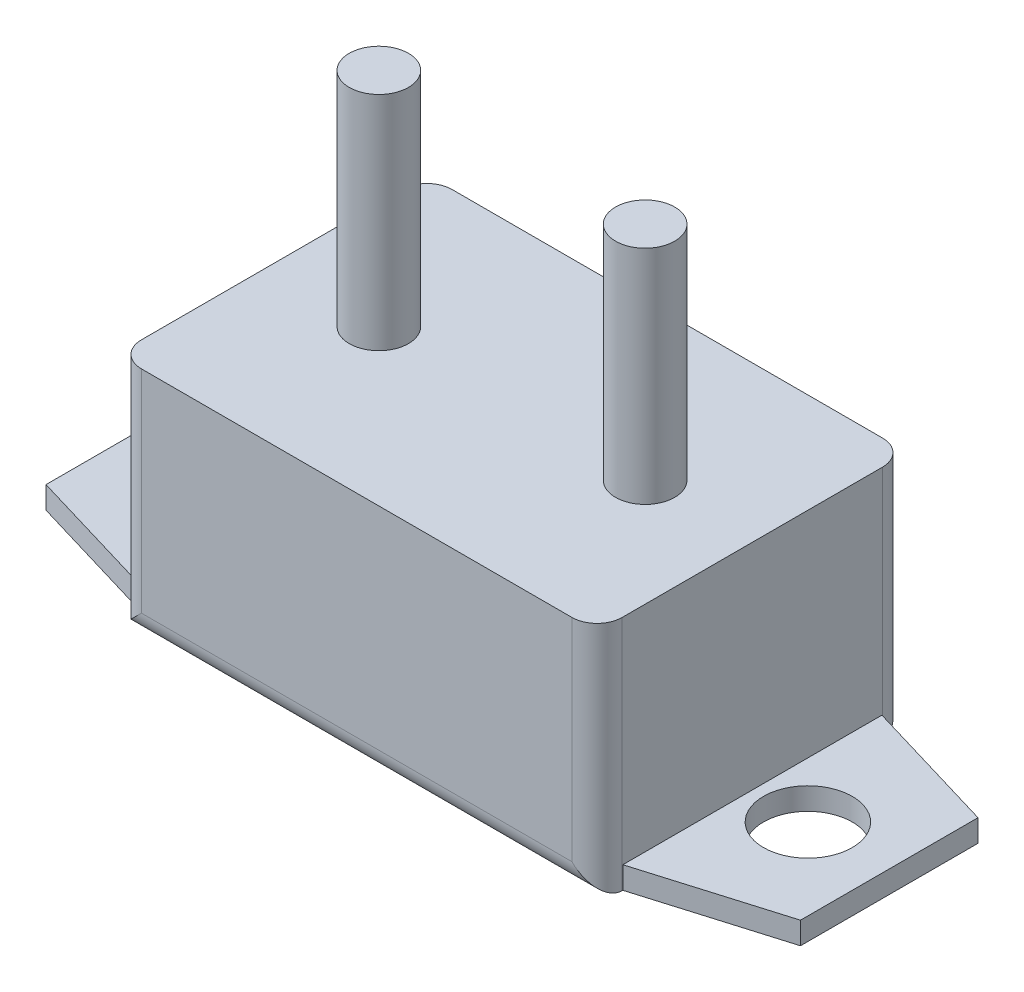
ISO-10303-21;
HEADER;
FILE_DESCRIPTION(('STEP AP214'),'2;1');
FILE_NAME('part.step','',(''),(''),'','','');
FILE_SCHEMA(('AUTOMOTIVE_DESIGN { 1 0 10303 214 1 1 1 1 }'));
ENDSEC;
DATA;
#1=APPLICATION_CONTEXT('core data for automotive mechanical design processes');
#2=APPLICATION_PROTOCOL_DEFINITION('international standard','automotive_design',2000,#1);
#3=PRODUCT_CONTEXT('',#1,'mechanical');
#4=PRODUCT('Part','Part','',(#3));
#5=PRODUCT_RELATED_PRODUCT_CATEGORY('part','',(#4));
#6=PRODUCT_DEFINITION_FORMATION('','',#4);
#7=PRODUCT_DEFINITION_CONTEXT('part definition',#1,'design');
#8=PRODUCT_DEFINITION('design','',#6,#7);
#9=PRODUCT_DEFINITION_SHAPE('','',#8);
#10=(LENGTH_UNIT() NAMED_UNIT(*) SI_UNIT(.MILLI.,.METRE.));
#11=(NAMED_UNIT(*) PLANE_ANGLE_UNIT() SI_UNIT($,.RADIAN.));
#12=(NAMED_UNIT(*) SI_UNIT($,.STERADIAN.) SOLID_ANGLE_UNIT());
#13=UNCERTAINTY_MEASURE_WITH_UNIT(LENGTH_MEASURE(1.E-05),#10,'distance_accuracy_value','');
#14=(GEOMETRIC_REPRESENTATION_CONTEXT(3) GLOBAL_UNCERTAINTY_ASSIGNED_CONTEXT((#13)) GLOBAL_UNIT_ASSIGNED_CONTEXT((#10,
#11,#12)) REPRESENTATION_CONTEXT('',''));
#15=CARTESIAN_POINT('',(0.,0.,0.));
#16=DIRECTION('',(0.,0.,1.));
#17=DIRECTION('',(1.,0.,0.));
#18=AXIS2_PLACEMENT_3D('',#15,#16,#17);
#19=CARTESIAN_POINT('',(16.25,16.,-10.5));
#20=DIRECTION('',(-1.,0.,0.));
#21=DIRECTION('',(0.,0.,1.));
#22=AXIS2_PLACEMENT_3D('',#19,#20,#21);
#23=PLANE('',#22);
#24=DIRECTION('',(0.,0.,-1.));
#25=VECTOR('',#24,1.);
#26=CARTESIAN_POINT('',(16.25,0.,-10.5));
#27=LINE('',#26,#25);
#28=CARTESIAN_POINT('',(16.25,0.,-8.7543022393316));
#29=VERTEX_POINT('',#28);
#30=CARTESIAN_POINT('',(16.25,0.,-8.8));
#31=VERTEX_POINT('',#30);
#32=EDGE_CURVE('E275',#29,#31,#27,.T.);
#33=ORIENTED_EDGE('',*,*,#32,.T.);
#34=DIRECTION('',(0.,-1.,0.));
#35=VECTOR('',#34,1.);
#36=CARTESIAN_POINT('',(16.25,16.,-8.8));
#37=LINE('',#36,#35);
#38=CARTESIAN_POINT('',(16.25,16.,-8.8));
#39=VERTEX_POINT('',#38);
#40=EDGE_CURVE('E329',#31,#39,#37,.F.);
#41=ORIENTED_EDGE('',*,*,#40,.T.);
#42=DIRECTION('',(0.,0.,-1.));
#43=VECTOR('',#42,1.);
#44=CARTESIAN_POINT('',(16.25,16.,-10.5));
#45=LINE('',#44,#43);
#46=CARTESIAN_POINT('',(16.25,16.,8.79999999999999));
#47=VERTEX_POINT('',#46);
#48=EDGE_CURVE('E279',#47,#39,#45,.T.);
#49=ORIENTED_EDGE('',*,*,#48,.F.);
#50=DIRECTION('',(0.,-1.,0.));
#51=VECTOR('',#50,1.);
#52=CARTESIAN_POINT('',(16.25,16.,8.8));
#53=LINE('',#52,#51);
#54=CARTESIAN_POINT('',(16.25,0.,8.79999999999999));
#55=VERTEX_POINT('',#54);
#56=EDGE_CURVE('E326',#47,#55,#53,.T.);
#57=ORIENTED_EDGE('',*,*,#56,.T.);
#58=CARTESIAN_POINT('',(16.25,0.,8.7543022393316));
#59=VERTEX_POINT('',#58);
#60=EDGE_CURVE('E295',#55,#59,#27,.T.);
#61=ORIENTED_EDGE('',*,*,#60,.T.);
#62=DIRECTION('',(0.,-1.,0.));
#63=VECTOR('',#62,1.);
#64=CARTESIAN_POINT('',(16.25,1.5,8.7543022393316));
#65=LINE('',#64,#63);
#66=CARTESIAN_POINT('',(16.25,1.5,8.7543022393316));
#67=VERTEX_POINT('',#66);
#68=EDGE_CURVE('E183',#67,#59,#65,.T.);
#69=ORIENTED_EDGE('',*,*,#68,.F.);
#70=DIRECTION('',(0.,0.,-1.));
#71=VECTOR('',#70,1.);
#72=CARTESIAN_POINT('',(16.25,1.5,8.7543022393316));
#73=LINE('',#72,#71);
#74=CARTESIAN_POINT('',(16.25,1.5,-8.7543022393316));
#75=VERTEX_POINT('',#74);
#76=EDGE_CURVE('E175',#67,#75,#73,.T.);
#77=ORIENTED_EDGE('',*,*,#76,.T.);
#78=DIRECTION('',(0.,-1.,0.));
#79=VECTOR('',#78,1.);
#80=CARTESIAN_POINT('',(16.25,1.5,-8.7543022393316));
#81=LINE('',#80,#79);
#82=EDGE_CURVE('E157',#75,#29,#81,.T.);
#83=ORIENTED_EDGE('',*,*,#82,.T.);
#84=EDGE_LOOP('',(#33,#41,#49,#57,#61,#69,#77,#83));
#85=FACE_BOUND('',#84,.T.);
#86=ADVANCED_FACE('F41',(#85),#23,.F.);
#87=CARTESIAN_POINT('',(-16.25,16.,-10.5));
#88=DIRECTION('',(1.,0.,0.));
#89=DIRECTION('',(0.,0.,-1.));
#90=AXIS2_PLACEMENT_3D('',#87,#88,#89);
#91=PLANE('',#90);
#92=DIRECTION('',(0.,0.,1.));
#93=VECTOR('',#92,1.);
#94=CARTESIAN_POINT('',(-16.25,16.,-10.5));
#95=LINE('',#94,#93);
#96=CARTESIAN_POINT('',(-16.25,16.,-8.8));
#97=VERTEX_POINT('',#96);
#98=CARTESIAN_POINT('',(-16.25,16.,8.79999999999999));
#99=VERTEX_POINT('',#98);
#100=EDGE_CURVE('E287',#97,#99,#95,.T.);
#101=ORIENTED_EDGE('',*,*,#100,.F.);
#102=DIRECTION('',(0.,-1.,0.));
#103=VECTOR('',#102,1.);
#104=CARTESIAN_POINT('',(-16.25,16.,-8.8));
#105=LINE('',#104,#103);
#106=CARTESIAN_POINT('',(-16.25,0.,-8.8));
#107=VERTEX_POINT('',#106);
#108=EDGE_CURVE('E11',#97,#107,#105,.T.);
#109=ORIENTED_EDGE('',*,*,#108,.T.);
#110=DIRECTION('',(0.,0.,1.));
#111=VECTOR('',#110,1.);
#112=CARTESIAN_POINT('',(-16.25,0.,-10.5));
#113=LINE('',#112,#111);
#114=CARTESIAN_POINT('',(-16.25,0.,-8.7543022393316));
#115=VERTEX_POINT('',#114);
#116=EDGE_CURVE('E284',#107,#115,#113,.T.);
#117=ORIENTED_EDGE('',*,*,#116,.T.);
#118=DIRECTION('',(0.,-1.,0.));
#119=VECTOR('',#118,1.);
#120=CARTESIAN_POINT('',(-16.25,1.5,-8.7543022393316));
#121=LINE('',#120,#119);
#122=CARTESIAN_POINT('',(-16.25,1.5,-8.7543022393316));
#123=VERTEX_POINT('',#122);
#124=EDGE_CURVE('E249',#123,#115,#121,.T.);
#125=ORIENTED_EDGE('',*,*,#124,.F.);
#126=DIRECTION('',(0.,0.,1.));
#127=VECTOR('',#126,1.);
#128=CARTESIAN_POINT('',(-16.25,1.5,8.7543022393316));
#129=LINE('',#128,#127);
#130=CARTESIAN_POINT('',(-16.25,1.5,8.7543022393316));
#131=VERTEX_POINT('',#130);
#132=EDGE_CURVE('E221',#123,#131,#129,.T.);
#133=ORIENTED_EDGE('',*,*,#132,.T.);
#134=DIRECTION('',(0.,-1.,0.));
#135=VECTOR('',#134,1.);
#136=CARTESIAN_POINT('',(-16.25,1.5,8.7543022393316));
#137=LINE('',#136,#135);
#138=CARTESIAN_POINT('',(-16.25,0.,8.75430223933159));
#139=VERTEX_POINT('',#138);
#140=EDGE_CURVE('E238',#131,#139,#137,.T.);
#141=ORIENTED_EDGE('',*,*,#140,.T.);
#142=CARTESIAN_POINT('',(-16.25,0.,8.79999999999999));
#143=VERTEX_POINT('',#142);
#144=EDGE_CURVE('E298',#139,#143,#113,.T.);
#145=ORIENTED_EDGE('',*,*,#144,.T.);
#146=DIRECTION('',(0.,-1.,0.));
#147=VECTOR('',#146,1.);
#148=CARTESIAN_POINT('',(-16.25,16.,8.8));
#149=LINE('',#148,#147);
#150=EDGE_CURVE('E51',#143,#99,#149,.F.);
#151=ORIENTED_EDGE('',*,*,#150,.T.);
#152=EDGE_LOOP('',(#101,#109,#117,#125,#133,#141,#145,#151));
#153=FACE_BOUND('',#152,.T.);
#154=ADVANCED_FACE('F394',(#153),#91,.F.);
#155=CARTESIAN_POINT('',(-16.25,16.,-10.5));
#156=DIRECTION('',(0.,0.,1.));
#157=DIRECTION('',(1.,0.,0.));
#158=AXIS2_PLACEMENT_3D('',#155,#156,#157);
#159=PLANE('',#158);
#160=DIRECTION('',(-1.,0.,0.));
#161=VECTOR('',#160,1.);
#162=CARTESIAN_POINT('',(-16.25,16.,-10.5));
#163=LINE('',#162,#161);
#164=CARTESIAN_POINT('',(14.55,16.,-10.5));
#165=VERTEX_POINT('',#164);
#166=CARTESIAN_POINT('',(-14.55,16.,-10.5));
#167=VERTEX_POINT('',#166);
#168=EDGE_CURVE('E283',#165,#167,#163,.T.);
#169=ORIENTED_EDGE('',*,*,#168,.F.);
#170=DIRECTION('',(0.,-1.,0.));
#171=VECTOR('',#170,1.);
#172=CARTESIAN_POINT('',(14.55,16.,-10.5));
#173=LINE('',#172,#171);
#174=CARTESIAN_POINT('',(14.55,1.7,-10.5));
#175=VERTEX_POINT('',#174);
#176=EDGE_CURVE('E307',#165,#175,#173,.T.);
#177=ORIENTED_EDGE('',*,*,#176,.T.);
#178=DIRECTION('',(-1.,0.,0.));
#179=VECTOR('',#178,1.);
#180=CARTESIAN_POINT('',(-16.25,1.7,-10.5));
#181=LINE('',#180,#179);
#182=CARTESIAN_POINT('',(-14.55,1.7,-10.5));
#183=VERTEX_POINT('',#182);
#184=EDGE_CURVE('E303',#175,#183,#181,.T.);
#185=ORIENTED_EDGE('',*,*,#184,.T.);
#186=DIRECTION('',(0.,-1.,0.));
#187=VECTOR('',#186,1.);
#188=CARTESIAN_POINT('',(-14.55,16.,-10.5));
#189=LINE('',#188,#187);
#190=EDGE_CURVE('E294',#183,#167,#189,.F.);
#191=ORIENTED_EDGE('',*,*,#190,.T.);
#192=EDGE_LOOP('',(#169,#177,#185,#191));
#193=FACE_BOUND('',#192,.T.);
#194=ADVANCED_FACE('F389',(#193),#159,.F.);
#195=CARTESIAN_POINT('',(-16.25,16.,10.5));
#196=DIRECTION('',(0.,0.,-1.));
#197=DIRECTION('',(-1.,0.,0.));
#198=AXIS2_PLACEMENT_3D('',#195,#196,#197);
#199=PLANE('',#198);
#200=DIRECTION('',(1.,0.,0.));
#201=VECTOR('',#200,1.);
#202=CARTESIAN_POINT('',(-16.25,1.7,10.5));
#203=LINE('',#202,#201);
#204=CARTESIAN_POINT('',(-14.55,1.7,10.5));
#205=VERTEX_POINT('',#204);
#206=CARTESIAN_POINT('',(14.55,1.7,10.5));
#207=VERTEX_POINT('',#206);
#208=EDGE_CURVE('E319',#205,#207,#203,.T.);
#209=ORIENTED_EDGE('',*,*,#208,.T.);
#210=DIRECTION('',(0.,-1.,0.));
#211=VECTOR('',#210,1.);
#212=CARTESIAN_POINT('',(14.55,16.,10.5));
#213=LINE('',#212,#211);
#214=CARTESIAN_POINT('',(14.55,16.,10.5));
#215=VERTEX_POINT('',#214);
#216=EDGE_CURVE('E323',#207,#215,#213,.F.);
#217=ORIENTED_EDGE('',*,*,#216,.T.);
#218=DIRECTION('',(1.,0.,0.));
#219=VECTOR('',#218,1.);
#220=CARTESIAN_POINT('',(-16.25,16.,10.5));
#221=LINE('',#220,#219);
#222=CARTESIAN_POINT('',(-14.55,16.,10.5));
#223=VERTEX_POINT('',#222);
#224=EDGE_CURVE('E290',#223,#215,#221,.T.);
#225=ORIENTED_EDGE('',*,*,#224,.F.);
#226=DIRECTION('',(0.,-1.,0.));
#227=VECTOR('',#226,1.);
#228=CARTESIAN_POINT('',(-14.55,16.,10.5));
#229=LINE('',#228,#227);
#230=EDGE_CURVE('E316',#223,#205,#229,.T.);
#231=ORIENTED_EDGE('',*,*,#230,.T.);
#232=EDGE_LOOP('',(#209,#217,#225,#231));
#233=FACE_BOUND('',#232,.T.);
#234=ADVANCED_FACE('F369',(#233),#199,.F.);
#235=CARTESIAN_POINT('',(0.,16.,0.));
#236=DIRECTION('',(0.,1.,0.));
#237=DIRECTION('',(0.,0.,1.));
#238=AXIS2_PLACEMENT_3D('',#235,#236,#237);
#239=PLANE('',#238);
#240=CARTESIAN_POINT('',(9.,16.,0.));
#241=DIRECTION('',(0.,1.,0.));
#242=DIRECTION('',(0.,0.,-1.));
#243=AXIS2_PLACEMENT_3D('',#240,#241,#242);
#244=CIRCLE('',#243,2.);
#245=CARTESIAN_POINT('',(9.,16.,-2.));
#246=VERTEX_POINT('',#245);
#247=EDGE_CURVE('E253',#246,#246,#244,.T.);
#248=ORIENTED_EDGE('',*,*,#247,.F.);
#249=EDGE_LOOP('',(#248));
#250=FACE_BOUND('',#249,.T.);
#251=CARTESIAN_POINT('',(-9.,16.,0.));
#252=DIRECTION('',(0.,1.,0.));
#253=DIRECTION('',(0.,0.,1.));
#254=AXIS2_PLACEMENT_3D('',#251,#252,#253);
#255=CIRCLE('',#254,2.);
#256=CARTESIAN_POINT('',(-9.,16.,2.));
#257=VERTEX_POINT('',#256);
#258=EDGE_CURVE('E267',#257,#257,#255,.T.);
#259=ORIENTED_EDGE('',*,*,#258,.F.);
#260=EDGE_LOOP('',(#259));
#261=FACE_BOUND('',#260,.T.);
#262=ORIENTED_EDGE('',*,*,#48,.T.);
#263=CARTESIAN_POINT('',(14.55,16.,-8.8));
#264=DIRECTION('',(0.,1.,0.));
#265=DIRECTION('',(0.,0.,1.));
#266=AXIS2_PLACEMENT_3D('',#263,#264,#265);
#267=CIRCLE('',#266,1.7);
#268=EDGE_CURVE('E340',#39,#165,#267,.T.);
#269=ORIENTED_EDGE('',*,*,#268,.T.);
#270=ORIENTED_EDGE('',*,*,#168,.T.);
#271=CARTESIAN_POINT('',(-14.55,16.,-8.8));
#272=DIRECTION('',(0.,1.,0.));
#273=DIRECTION('',(0.,0.,1.));
#274=AXIS2_PLACEMENT_3D('',#271,#272,#273);
#275=CIRCLE('',#274,1.7);
#276=EDGE_CURVE('E65',#167,#97,#275,.T.);
#277=ORIENTED_EDGE('',*,*,#276,.T.);
#278=ORIENTED_EDGE('',*,*,#100,.T.);
#279=CARTESIAN_POINT('',(-14.55,16.,8.8));
#280=DIRECTION('',(0.,1.,0.));
#281=DIRECTION('',(0.,0.,1.));
#282=AXIS2_PLACEMENT_3D('',#279,#280,#281);
#283=CIRCLE('',#282,1.7);
#284=EDGE_CURVE('E332',#99,#223,#283,.T.);
#285=ORIENTED_EDGE('',*,*,#284,.T.);
#286=ORIENTED_EDGE('',*,*,#224,.T.);
#287=CARTESIAN_POINT('',(14.55,16.,8.8));
#288=DIRECTION('',(0.,1.,0.));
#289=DIRECTION('',(0.,0.,1.));
#290=AXIS2_PLACEMENT_3D('',#287,#288,#289);
#291=CIRCLE('',#290,1.7);
#292=EDGE_CURVE('E337',#215,#47,#291,.T.);
#293=ORIENTED_EDGE('',*,*,#292,.T.);
#294=EDGE_LOOP('',(#262,#269,#270,#277,#278,#285,#286,#293));
#295=FACE_BOUND('',#294,.T.);
#296=ADVANCED_FACE('F366',(#250,#261,#295),#239,.T.);
#297=CARTESIAN_POINT('',(0.,0.,0.));
#298=DIRECTION('',(0.,1.,0.));
#299=DIRECTION('',(0.,0.,1.));
#300=AXIS2_PLACEMENT_3D('',#297,#298,#299);
#301=PLANE('',#300);
#302=ORIENTED_EDGE('',*,*,#116,.F.);
#303=DIRECTION('',(-1.,0.,0.));
#304=VECTOR('',#303,1.);
#305=CARTESIAN_POINT('',(0.,0.,-8.8));
#306=LINE('',#305,#304);
#307=EDGE_CURVE('E313',#107,#31,#306,.F.);
#308=ORIENTED_EDGE('',*,*,#307,.T.);
#309=ORIENTED_EDGE('',*,*,#32,.F.);
#310=DIRECTION('',(0.958414506055737,0.,0.285379807593211));
#311=VECTOR('',#310,1.);
#312=CARTESIAN_POINT('',(16.25,0.,-8.7543022393316));
#313=LINE('',#312,#311);
#314=CARTESIAN_POINT('',(25.5,0.,-6.));
#315=VERTEX_POINT('',#314);
#316=EDGE_CURVE('E162',#29,#315,#313,.T.);
#317=ORIENTED_EDGE('',*,*,#316,.T.);
#318=DIRECTION('',(0.,0.,1.));
#319=VECTOR('',#318,1.);
#320=CARTESIAN_POINT('',(25.5,0.,6.));
#321=LINE('',#320,#319);
#322=CARTESIAN_POINT('',(25.5,0.,6.));
#323=VERTEX_POINT('',#322);
#324=EDGE_CURVE('E189',#315,#323,#321,.T.);
#325=ORIENTED_EDGE('',*,*,#324,.T.);
#326=DIRECTION('',(-0.958414506055737,0.,0.285379807593211));
#327=VECTOR('',#326,1.);
#328=CARTESIAN_POINT('',(16.25,0.,8.7543022393316));
#329=LINE('',#328,#327);
#330=EDGE_CURVE('E185',#323,#59,#329,.T.);
#331=ORIENTED_EDGE('',*,*,#330,.T.);
#332=ORIENTED_EDGE('',*,*,#60,.F.);
#333=DIRECTION('',(1.,0.,0.));
#334=VECTOR('',#333,1.);
#335=CARTESIAN_POINT('',(0.,0.,8.8));
#336=LINE('',#335,#334);
#337=EDGE_CURVE('E310',#55,#143,#336,.F.);
#338=ORIENTED_EDGE('',*,*,#337,.T.);
#339=ORIENTED_EDGE('',*,*,#144,.F.);
#340=DIRECTION('',(-0.958414506055737,0.,-0.285379807593212));
#341=VECTOR('',#340,1.);
#342=CARTESIAN_POINT('',(-16.25,0.,8.7543022393316));
#343=LINE('',#342,#341);
#344=CARTESIAN_POINT('',(-25.5,0.,5.99999999999999));
#345=VERTEX_POINT('',#344);
#346=EDGE_CURVE('E217',#139,#345,#343,.T.);
#347=ORIENTED_EDGE('',*,*,#346,.T.);
#348=DIRECTION('',(0.,0.,-1.));
#349=VECTOR('',#348,1.);
#350=CARTESIAN_POINT('',(-25.5,0.,5.99999999999999));
#351=LINE('',#350,#349);
#352=CARTESIAN_POINT('',(-25.5,0.,-5.99999999999999));
#353=VERTEX_POINT('',#352);
#354=EDGE_CURVE('E242',#345,#353,#351,.T.);
#355=ORIENTED_EDGE('',*,*,#354,.T.);
#356=DIRECTION('',(0.958414506055737,0.,-0.285379807593212));
#357=VECTOR('',#356,1.);
#358=CARTESIAN_POINT('',(-16.25,0.,-8.7543022393316));
#359=LINE('',#358,#357);
#360=EDGE_CURVE('E226',#353,#115,#359,.T.);
#361=ORIENTED_EDGE('',*,*,#360,.T.);
#362=EDGE_LOOP('',(#302,#308,#309,#317,#325,#331,#332,#338,#339,#347,#355,#361));
#363=FACE_BOUND('',#362,.T.);
#364=CARTESIAN_POINT('',(-20.,0.,0.));
#365=DIRECTION('',(0.,-1.,0.));
#366=DIRECTION('',(0.,0.,-1.));
#367=AXIS2_PLACEMENT_3D('',#364,#365,#366);
#368=CIRCLE('',#367,3.);
#369=CARTESIAN_POINT('',(-20.,0.,-3.));
#370=VERTEX_POINT('',#369);
#371=EDGE_CURVE('E207',#370,#370,#368,.T.);
#372=ORIENTED_EDGE('',*,*,#371,.F.);
#373=EDGE_LOOP('',(#372));
#374=FACE_BOUND('',#373,.T.);
#375=CARTESIAN_POINT('',(20.,0.,0.));
#376=DIRECTION('',(0.,-1.,0.));
#377=DIRECTION('',(0.,0.,1.));
#378=AXIS2_PLACEMENT_3D('',#375,#376,#377);
#379=CIRCLE('',#378,3.);
#380=CARTESIAN_POINT('',(20.,0.,3.));
#381=VERTEX_POINT('',#380);
#382=EDGE_CURVE('E192',#381,#381,#379,.T.);
#383=ORIENTED_EDGE('',*,*,#382,.F.);
#384=EDGE_LOOP('',(#383));
#385=FACE_BOUND('',#384,.T.);
#386=ADVANCED_FACE('F397',(#363,#374,#385),#301,.F.);
#387=CARTESIAN_POINT('',(-9.,31.,0.));
#388=DIRECTION('',(0.,-1.,0.));
#389=DIRECTION('',(0.,0.,-1.));
#390=AXIS2_PLACEMENT_3D('',#387,#388,#389);
#391=CYLINDRICAL_SURFACE('',#390,2.);
#392=CARTESIAN_POINT('',(-9.,31.,0.));
#393=DIRECTION('',(0.,1.,0.));
#394=DIRECTION('',(0.,0.,1.));
#395=AXIS2_PLACEMENT_3D('',#392,#393,#394);
#396=CIRCLE('',#395,2.);
#397=CARTESIAN_POINT('',(-9.,31.,2.));
#398=VERTEX_POINT('',#397);
#399=EDGE_CURVE('E271',#398,#398,#396,.T.);
#400=ORIENTED_EDGE('',*,*,#399,.F.);
#401=EDGE_LOOP('',(#400));
#402=FACE_BOUND('',#401,.T.);
#403=ORIENTED_EDGE('',*,*,#258,.T.);
#404=EDGE_LOOP('',(#403));
#405=FACE_BOUND('',#404,.T.);
#406=ADVANCED_FACE('F571',(#402,#405),#391,.T.);
#407=CARTESIAN_POINT('',(-9.,31.,0.));
#408=DIRECTION('',(0.,1.,0.));
#409=DIRECTION('',(0.,0.,1.));
#410=AXIS2_PLACEMENT_3D('',#407,#408,#409);
#411=PLANE('',#410);
#412=ORIENTED_EDGE('',*,*,#399,.T.);
#413=EDGE_LOOP('',(#412));
#414=FACE_BOUND('',#413,.T.);
#415=ADVANCED_FACE('F560',(#414),#411,.T.);
#416=CARTESIAN_POINT('',(9.,31.,0.));
#417=DIRECTION('',(0.,-1.,0.));
#418=DIRECTION('',(0.,0.,-1.));
#419=AXIS2_PLACEMENT_3D('',#416,#417,#418);
#420=CYLINDRICAL_SURFACE('',#419,2.);
#421=CARTESIAN_POINT('',(9.,31.,0.));
#422=DIRECTION('',(0.,1.,0.));
#423=DIRECTION('',(0.,0.,-1.));
#424=AXIS2_PLACEMENT_3D('',#421,#422,#423);
#425=CIRCLE('',#424,2.);
#426=CARTESIAN_POINT('',(9.,31.,-2.));
#427=VERTEX_POINT('',#426);
#428=EDGE_CURVE('E263',#427,#427,#425,.T.);
#429=ORIENTED_EDGE('',*,*,#428,.F.);
#430=EDGE_LOOP('',(#429));
#431=FACE_BOUND('',#430,.T.);
#432=ORIENTED_EDGE('',*,*,#247,.T.);
#433=EDGE_LOOP('',(#432));
#434=FACE_BOUND('',#433,.T.);
#435=ADVANCED_FACE('F547',(#431,#434),#420,.T.);
#436=CARTESIAN_POINT('',(9.,31.,0.));
#437=DIRECTION('',(0.,-1.,0.));
#438=DIRECTION('',(0.,0.,-1.));
#439=AXIS2_PLACEMENT_3D('',#436,#437,#438);
#440=PLANE('',#439);
#441=ORIENTED_EDGE('',*,*,#428,.T.);
#442=EDGE_LOOP('',(#441));
#443=FACE_BOUND('',#442,.T.);
#444=ADVANCED_FACE('F536',(#443),#440,.F.);
#445=CARTESIAN_POINT('',(-16.25,1.5,-8.7543022393316));
#446=DIRECTION('',(-0.285379807593212,0.,-0.958414506055736));
#447=DIRECTION('',(-0.958414506055737,0.,0.285379807593212));
#448=AXIS2_PLACEMENT_3D('',#445,#446,#447);
#449=PLANE('',#448);
#450=ORIENTED_EDGE('',*,*,#360,.F.);
#451=DIRECTION('',(0.,-1.,0.));
#452=VECTOR('',#451,1.);
#453=CARTESIAN_POINT('',(-25.5,1.5,-5.99999999999999));
#454=LINE('',#453,#452);
#455=CARTESIAN_POINT('',(-25.5,1.5,-5.99999999999999));
#456=VERTEX_POINT('',#455);
#457=EDGE_CURVE('E254',#456,#353,#454,.T.);
#458=ORIENTED_EDGE('',*,*,#457,.F.);
#459=DIRECTION('',(0.958414506055737,0.,-0.285379807593212));
#460=VECTOR('',#459,1.);
#461=CARTESIAN_POINT('',(-16.25,1.5,-8.7543022393316));
#462=LINE('',#461,#460);
#463=EDGE_CURVE('E234',#456,#123,#462,.T.);
#464=ORIENTED_EDGE('',*,*,#463,.T.);
#465=ORIENTED_EDGE('',*,*,#124,.T.);
#466=EDGE_LOOP('',(#450,#458,#464,#465));
#467=FACE_BOUND('',#466,.T.);
#468=ADVANCED_FACE('F402',(#467),#449,.T.);
#469=CARTESIAN_POINT('',(-25.5,1.5,5.99999999999999));
#470=DIRECTION('',(-1.,0.,0.));
#471=DIRECTION('',(0.,0.,1.));
#472=AXIS2_PLACEMENT_3D('',#469,#470,#471);
#473=PLANE('',#472);
#474=ORIENTED_EDGE('',*,*,#354,.F.);
#475=DIRECTION('',(0.,-1.,0.));
#476=VECTOR('',#475,1.);
#477=CARTESIAN_POINT('',(-25.5,1.5,5.99999999999999));
#478=LINE('',#477,#476);
#479=CARTESIAN_POINT('',(-25.5,1.5,5.99999999999999));
#480=VERTEX_POINT('',#479);
#481=EDGE_CURVE('E257',#480,#345,#478,.T.);
#482=ORIENTED_EDGE('',*,*,#481,.F.);
#483=DIRECTION('',(0.,0.,-1.));
#484=VECTOR('',#483,1.);
#485=CARTESIAN_POINT('',(-25.5,1.5,5.99999999999999));
#486=LINE('',#485,#484);
#487=EDGE_CURVE('E230',#480,#456,#486,.T.);
#488=ORIENTED_EDGE('',*,*,#487,.T.);
#489=ORIENTED_EDGE('',*,*,#457,.T.);
#490=EDGE_LOOP('',(#474,#482,#488,#489));
#491=FACE_BOUND('',#490,.T.);
#492=ADVANCED_FACE('F518',(#491),#473,.T.);
#493=CARTESIAN_POINT('',(-16.25,1.5,8.7543022393316));
#494=DIRECTION('',(-0.285379807593212,0.,0.958414506055736));
#495=DIRECTION('',(0.958414506055737,0.,0.285379807593212));
#496=AXIS2_PLACEMENT_3D('',#493,#494,#495);
#497=PLANE('',#496);
#498=ORIENTED_EDGE('',*,*,#346,.F.);
#499=ORIENTED_EDGE('',*,*,#140,.F.);
#500=DIRECTION('',(-0.958414506055737,0.,-0.285379807593212));
#501=VECTOR('',#500,1.);
#502=CARTESIAN_POINT('',(-16.25,1.5,8.7543022393316));
#503=LINE('',#502,#501);
#504=EDGE_CURVE('E225',#131,#480,#503,.T.);
#505=ORIENTED_EDGE('',*,*,#504,.T.);
#506=ORIENTED_EDGE('',*,*,#481,.T.);
#507=EDGE_LOOP('',(#498,#499,#505,#506));
#508=FACE_BOUND('',#507,.T.);
#509=ADVANCED_FACE('F410',(#508),#497,.T.);
#510=CARTESIAN_POINT('',(0.,1.5,0.));
#511=DIRECTION('',(0.,1.,0.));
#512=DIRECTION('',(0.,0.,1.));
#513=AXIS2_PLACEMENT_3D('',#510,#511,#512);
#514=PLANE('',#513);
#515=CARTESIAN_POINT('',(-20.,1.5,0.));
#516=DIRECTION('',(0.,-1.,0.));
#517=DIRECTION('',(0.,0.,-1.));
#518=AXIS2_PLACEMENT_3D('',#515,#516,#517);
#519=CIRCLE('',#518,3.);
#520=CARTESIAN_POINT('',(-20.,1.5,-3.));
#521=VERTEX_POINT('',#520);
#522=EDGE_CURVE('E213',#521,#521,#519,.T.);
#523=ORIENTED_EDGE('',*,*,#522,.T.);
#524=EDGE_LOOP('',(#523));
#525=FACE_BOUND('',#524,.T.);
#526=ORIENTED_EDGE('',*,*,#132,.F.);
#527=ORIENTED_EDGE('',*,*,#463,.F.);
#528=ORIENTED_EDGE('',*,*,#487,.F.);
#529=ORIENTED_EDGE('',*,*,#504,.F.);
#530=EDGE_LOOP('',(#526,#527,#528,#529));
#531=FACE_BOUND('',#530,.T.);
#532=ADVANCED_FACE('F407',(#525,#531),#514,.T.);
#533=CARTESIAN_POINT('',(-20.,1.5,0.));
#534=DIRECTION('',(0.,-1.,0.));
#535=DIRECTION('',(0.,0.,-1.));
#536=AXIS2_PLACEMENT_3D('',#533,#534,#535);
#537=CYLINDRICAL_SURFACE('',#536,3.);
#538=ORIENTED_EDGE('',*,*,#522,.F.);
#539=EDGE_LOOP('',(#538));
#540=FACE_BOUND('',#539,.T.);
#541=ORIENTED_EDGE('',*,*,#371,.T.);
#542=EDGE_LOOP('',(#541));
#543=FACE_BOUND('',#542,.T.);
#544=ADVANCED_FACE('F426',(#540,#543),#537,.F.);
#545=CARTESIAN_POINT('',(16.25,1.5,8.7543022393316));
#546=DIRECTION('',(0.285379807593211,0.,0.958414506055737));
#547=DIRECTION('',(0.958414506055737,0.,-0.285379807593211));
#548=AXIS2_PLACEMENT_3D('',#545,#546,#547);
#549=PLANE('',#548);
#550=ORIENTED_EDGE('',*,*,#330,.F.);
#551=DIRECTION('',(0.,-1.,0.));
#552=VECTOR('',#551,1.);
#553=CARTESIAN_POINT('',(25.5,1.5,6.));
#554=LINE('',#553,#552);
#555=CARTESIAN_POINT('',(25.5,1.5,6.));
#556=VERTEX_POINT('',#555);
#557=EDGE_CURVE('E208',#556,#323,#554,.T.);
#558=ORIENTED_EDGE('',*,*,#557,.F.);
#559=DIRECTION('',(-0.958414506055737,0.,0.285379807593211));
#560=VECTOR('',#559,1.);
#561=CARTESIAN_POINT('',(16.25,1.5,8.7543022393316));
#562=LINE('',#561,#560);
#563=EDGE_CURVE('E169',#556,#67,#562,.T.);
#564=ORIENTED_EDGE('',*,*,#563,.T.);
#565=ORIENTED_EDGE('',*,*,#68,.T.);
#566=EDGE_LOOP('',(#550,#558,#564,#565));
#567=FACE_BOUND('',#566,.T.);
#568=ADVANCED_FACE('F415',(#567),#549,.T.);
#569=CARTESIAN_POINT('',(25.5,1.5,6.));
#570=DIRECTION('',(1.,0.,0.));
#571=DIRECTION('',(0.,0.,-1.));
#572=AXIS2_PLACEMENT_3D('',#569,#570,#571);
#573=PLANE('',#572);
#574=ORIENTED_EDGE('',*,*,#324,.F.);
#575=DIRECTION('',(0.,-1.,0.));
#576=VECTOR('',#575,1.);
#577=CARTESIAN_POINT('',(25.5,1.5,-6.));
#578=LINE('',#577,#576);
#579=CARTESIAN_POINT('',(25.5,1.5,-6.));
#580=VERTEX_POINT('',#579);
#581=EDGE_CURVE('E168',#580,#315,#578,.T.);
#582=ORIENTED_EDGE('',*,*,#581,.F.);
#583=DIRECTION('',(0.,0.,1.));
#584=VECTOR('',#583,1.);
#585=CARTESIAN_POINT('',(25.5,1.5,6.));
#586=LINE('',#585,#584);
#587=EDGE_CURVE('E178',#580,#556,#586,.T.);
#588=ORIENTED_EDGE('',*,*,#587,.T.);
#589=ORIENTED_EDGE('',*,*,#557,.T.);
#590=EDGE_LOOP('',(#574,#582,#588,#589));
#591=FACE_BOUND('',#590,.T.);
#592=ADVANCED_FACE('F418',(#591),#573,.T.);
#593=CARTESIAN_POINT('',(16.25,1.5,-8.7543022393316));
#594=DIRECTION('',(0.285379807593211,0.,-0.958414506055737));
#595=DIRECTION('',(-0.958414506055737,0.,-0.285379807593211));
#596=AXIS2_PLACEMENT_3D('',#593,#594,#595);
#597=PLANE('',#596);
#598=ORIENTED_EDGE('',*,*,#316,.F.);
#599=ORIENTED_EDGE('',*,*,#82,.F.);
#600=DIRECTION('',(0.958414506055737,0.,0.285379807593211));
#601=VECTOR('',#600,1.);
#602=CARTESIAN_POINT('',(16.25,1.5,-8.7543022393316));
#603=LINE('',#602,#601);
#604=EDGE_CURVE('E160',#75,#580,#603,.T.);
#605=ORIENTED_EDGE('',*,*,#604,.T.);
#606=ORIENTED_EDGE('',*,*,#581,.T.);
#607=EDGE_LOOP('',(#598,#599,#605,#606));
#608=FACE_BOUND('',#607,.T.);
#609=ADVANCED_FACE('F159',(#608),#597,.T.);
#610=CARTESIAN_POINT('',(0.,1.5,0.));
#611=DIRECTION('',(0.,-1.,0.));
#612=DIRECTION('',(0.,0.,-1.));
#613=AXIS2_PLACEMENT_3D('',#610,#611,#612);
#614=PLANE('',#613);
#615=CARTESIAN_POINT('',(20.,1.5,0.));
#616=DIRECTION('',(0.,-1.,0.));
#617=DIRECTION('',(0.,0.,1.));
#618=AXIS2_PLACEMENT_3D('',#615,#616,#617);
#619=CIRCLE('',#618,3.);
#620=CARTESIAN_POINT('',(20.,1.5,3.));
#621=VERTEX_POINT('',#620);
#622=EDGE_CURVE('E201',#621,#621,#619,.T.);
#623=ORIENTED_EDGE('',*,*,#622,.T.);
#624=EDGE_LOOP('',(#623));
#625=FACE_BOUND('',#624,.T.);
#626=ORIENTED_EDGE('',*,*,#76,.F.);
#627=ORIENTED_EDGE('',*,*,#563,.F.);
#628=ORIENTED_EDGE('',*,*,#587,.F.);
#629=ORIENTED_EDGE('',*,*,#604,.F.);
#630=EDGE_LOOP('',(#626,#627,#628,#629));
#631=FACE_BOUND('',#630,.T.);
#632=ADVANCED_FACE('F173',(#625,#631),#614,.F.);
#633=CARTESIAN_POINT('',(20.,1.5,0.));
#634=DIRECTION('',(0.,-1.,0.));
#635=DIRECTION('',(0.,0.,-1.));
#636=AXIS2_PLACEMENT_3D('',#633,#634,#635);
#637=CYLINDRICAL_SURFACE('',#636,3.);
#638=ORIENTED_EDGE('',*,*,#622,.F.);
#639=EDGE_LOOP('',(#638));
#640=FACE_BOUND('',#639,.T.);
#641=ORIENTED_EDGE('',*,*,#382,.T.);
#642=EDGE_LOOP('',(#641));
#643=FACE_BOUND('',#642,.T.);
#644=ADVANCED_FACE('F442',(#640,#643),#637,.F.);
#645=CARTESIAN_POINT('',(14.55,16.,-8.8));
#646=DIRECTION('',(0.,-1.,0.));
#647=DIRECTION('',(0.,0.,-1.));
#648=AXIS2_PLACEMENT_3D('',#645,#646,#647);
#649=CYLINDRICAL_SURFACE('',#648,1.7);
#650=ORIENTED_EDGE('',*,*,#268,.F.);
#651=ORIENTED_EDGE('',*,*,#40,.F.);
#652=CARTESIAN_POINT('',(14.55,1.7,-8.8));
#653=DIRECTION('',(-0.707106781186547,-0.707106781186547,0.));
#654=DIRECTION('',(0.707106781186547,-0.707106781186547,0.));
#655=AXIS2_PLACEMENT_3D('',#652,#653,#654);
#656=ELLIPSE('',#655,2.40416305603426,1.7);
#657=EDGE_CURVE('E348',#175,#31,#656,.T.);
#658=ORIENTED_EDGE('',*,*,#657,.F.);
#659=ORIENTED_EDGE('',*,*,#176,.F.);
#660=EDGE_LOOP('',(#650,#651,#658,#659));
#661=FACE_BOUND('',#660,.T.);
#662=ADVANCED_FACE('F379',(#661),#649,.T.);
#663=CARTESIAN_POINT('',(-14.55,16.,-8.8));
#664=DIRECTION('',(0.,-1.,0.));
#665=DIRECTION('',(0.,0.,-1.));
#666=AXIS2_PLACEMENT_3D('',#663,#664,#665);
#667=CYLINDRICAL_SURFACE('',#666,1.7);
#668=ORIENTED_EDGE('',*,*,#276,.F.);
#669=ORIENTED_EDGE('',*,*,#190,.F.);
#670=CARTESIAN_POINT('',(-14.55,1.7,-8.8));
#671=DIRECTION('',(0.707106781186547,-0.707106781186547,0.));
#672=DIRECTION('',(-0.707106781186547,-0.707106781186547,0.));
#673=AXIS2_PLACEMENT_3D('',#670,#671,#672);
#674=ELLIPSE('',#673,2.40416305603426,1.7);
#675=EDGE_CURVE('E345',#107,#183,#674,.T.);
#676=ORIENTED_EDGE('',*,*,#675,.F.);
#677=ORIENTED_EDGE('',*,*,#108,.F.);
#678=EDGE_LOOP('',(#668,#669,#676,#677));
#679=FACE_BOUND('',#678,.T.);
#680=ADVANCED_FACE('F392',(#679),#667,.T.);
#681=CARTESIAN_POINT('',(-16.25,1.7,-8.8));
#682=DIRECTION('',(-1.,0.,0.));
#683=DIRECTION('',(0.,0.,1.));
#684=AXIS2_PLACEMENT_3D('',#681,#682,#683);
#685=CYLINDRICAL_SURFACE('',#684,1.7);
#686=ORIENTED_EDGE('',*,*,#657,.T.);
#687=ORIENTED_EDGE('',*,*,#307,.F.);
#688=ORIENTED_EDGE('',*,*,#675,.T.);
#689=ORIENTED_EDGE('',*,*,#184,.F.);
#690=EDGE_LOOP('',(#686,#687,#688,#689));
#691=FACE_BOUND('',#690,.T.);
#692=ADVANCED_FACE('F384',(#691),#685,.T.);
#693=CARTESIAN_POINT('',(-14.55,16.,8.8));
#694=DIRECTION('',(0.,-1.,0.));
#695=DIRECTION('',(0.,0.,-1.));
#696=AXIS2_PLACEMENT_3D('',#693,#694,#695);
#697=CYLINDRICAL_SURFACE('',#696,1.7);
#698=ORIENTED_EDGE('',*,*,#284,.F.);
#699=ORIENTED_EDGE('',*,*,#150,.F.);
#700=CARTESIAN_POINT('',(-14.55,1.7,8.8));
#701=DIRECTION('',(0.707106781186547,-0.707106781186547,0.));
#702=DIRECTION('',(-0.707106781186547,-0.707106781186547,0.));
#703=AXIS2_PLACEMENT_3D('',#700,#701,#702);
#704=ELLIPSE('',#703,2.40416305603426,1.7);
#705=EDGE_CURVE('E45',#205,#143,#704,.T.);
#706=ORIENTED_EDGE('',*,*,#705,.F.);
#707=ORIENTED_EDGE('',*,*,#230,.F.);
#708=EDGE_LOOP('',(#698,#699,#706,#707));
#709=FACE_BOUND('',#708,.T.);
#710=ADVANCED_FACE('F43',(#709),#697,.T.);
#711=CARTESIAN_POINT('',(14.55,16.,8.8));
#712=DIRECTION('',(0.,-1.,0.));
#713=DIRECTION('',(0.,0.,-1.));
#714=AXIS2_PLACEMENT_3D('',#711,#712,#713);
#715=CYLINDRICAL_SURFACE('',#714,1.7);
#716=ORIENTED_EDGE('',*,*,#292,.F.);
#717=ORIENTED_EDGE('',*,*,#216,.F.);
#718=CARTESIAN_POINT('',(14.55,1.7,8.8));
#719=DIRECTION('',(-0.707106781186547,-0.707106781186547,0.));
#720=DIRECTION('',(0.707106781186547,-0.707106781186547,0.));
#721=AXIS2_PLACEMENT_3D('',#718,#719,#720);
#722=ELLIPSE('',#721,2.40416305603426,1.7);
#723=EDGE_CURVE('E351',#55,#207,#722,.T.);
#724=ORIENTED_EDGE('',*,*,#723,.F.);
#725=ORIENTED_EDGE('',*,*,#56,.F.);
#726=EDGE_LOOP('',(#716,#717,#724,#725));
#727=FACE_BOUND('',#726,.T.);
#728=ADVANCED_FACE('F371',(#727),#715,.T.);
#729=CARTESIAN_POINT('',(-16.25,1.7,8.8));
#730=DIRECTION('',(1.,0.,0.));
#731=DIRECTION('',(0.,0.,-1.));
#732=AXIS2_PLACEMENT_3D('',#729,#730,#731);
#733=CYLINDRICAL_SURFACE('',#732,1.7);
#734=ORIENTED_EDGE('',*,*,#705,.T.);
#735=ORIENTED_EDGE('',*,*,#337,.F.);
#736=ORIENTED_EDGE('',*,*,#723,.T.);
#737=ORIENTED_EDGE('',*,*,#208,.F.);
#738=EDGE_LOOP('',(#734,#735,#736,#737));
#739=FACE_BOUND('',#738,.T.);
#740=ADVANCED_FACE('F361',(#739),#733,.T.);
#741=CLOSED_SHELL('',(#86,#154,#194,#234,#296,#386,#406,#415,#435,#444,#468,#492,#509,#532,#544,
#568,#592,#609,#632,#644,#662,#680,#692,#710,#728,#740));
#742=MANIFOLD_SOLID_BREP('B2',#741);
#743=ADVANCED_BREP_SHAPE_REPRESENTATION('',(#18,#742),#14);
#744=SHAPE_DEFINITION_REPRESENTATION(#9,#743);
ENDSEC;
END-ISO-10303-21;
